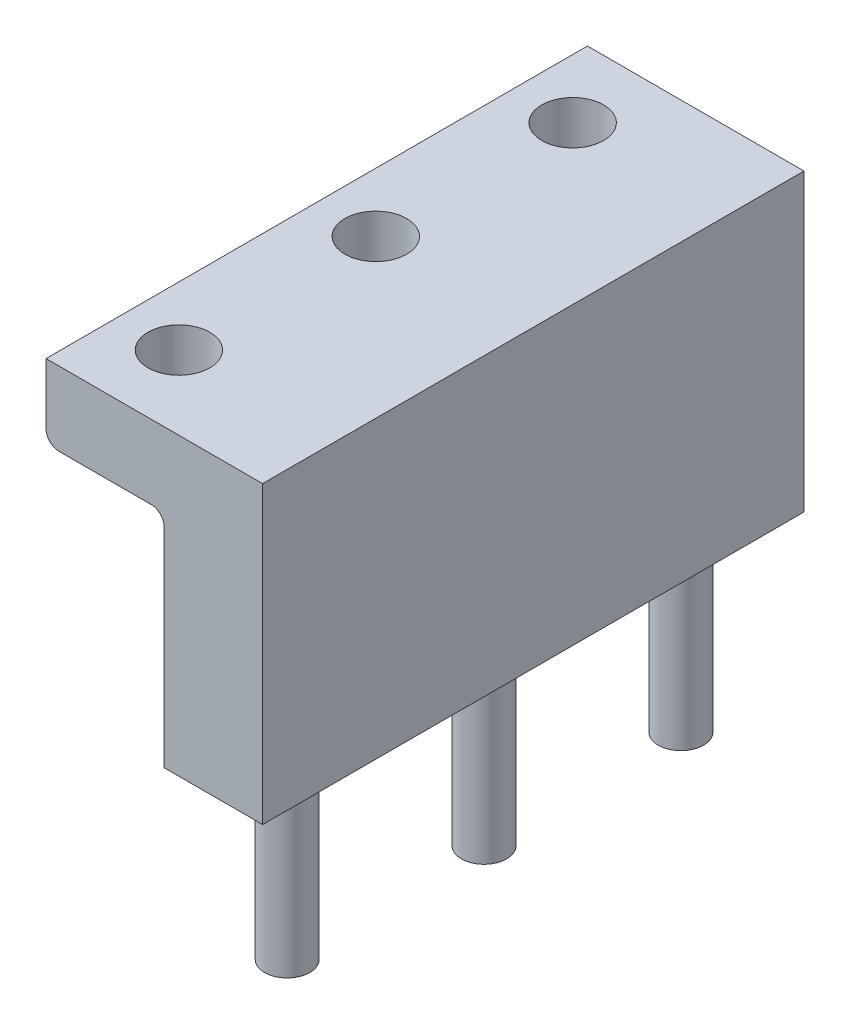
ISO-10303-21;
HEADER;
FILE_DESCRIPTION(('STEP AP214'),'2;1');
FILE_NAME('part.step','',(''),(''),'','','');
FILE_SCHEMA(('AUTOMOTIVE_DESIGN { 1 0 10303 214 1 1 1 1 }'));
ENDSEC;
DATA;
#1=APPLICATION_CONTEXT('core data for automotive mechanical design processes');
#2=APPLICATION_PROTOCOL_DEFINITION('international standard','automotive_design',2000,#1);
#3=PRODUCT_CONTEXT('',#1,'mechanical');
#4=PRODUCT('Part','Part','',(#3));
#5=PRODUCT_RELATED_PRODUCT_CATEGORY('part','',(#4));
#6=PRODUCT_DEFINITION_FORMATION('','',#4);
#7=PRODUCT_DEFINITION_CONTEXT('part definition',#1,'design');
#8=PRODUCT_DEFINITION('design','',#6,#7);
#9=PRODUCT_DEFINITION_SHAPE('','',#8);
#10=(LENGTH_UNIT() NAMED_UNIT(*) SI_UNIT(.MILLI.,.METRE.));
#11=(NAMED_UNIT(*) PLANE_ANGLE_UNIT() SI_UNIT($,.RADIAN.));
#12=(NAMED_UNIT(*) SI_UNIT($,.STERADIAN.) SOLID_ANGLE_UNIT());
#13=UNCERTAINTY_MEASURE_WITH_UNIT(LENGTH_MEASURE(1.E-05),#10,'distance_accuracy_value','');
#14=(GEOMETRIC_REPRESENTATION_CONTEXT(3) GLOBAL_UNCERTAINTY_ASSIGNED_CONTEXT((#13)) GLOBAL_UNIT_ASSIGNED_CONTEXT((#10,
#11,#12)) REPRESENTATION_CONTEXT('',''));
#15=CARTESIAN_POINT('',(0.,0.,0.));
#16=DIRECTION('',(0.,0.,1.));
#17=DIRECTION('',(1.,0.,0.));
#18=AXIS2_PLACEMENT_3D('',#15,#16,#17);
#19=CARTESIAN_POINT('',(374.55475,-81.3562,76.2));
#20=DIRECTION('',(0.,1.,0.));
#21=DIRECTION('',(0.,0.,1.));
#22=AXIS2_PLACEMENT_3D('',#19,#20,#21);
#23=PLANE('',#22);
#24=CARTESIAN_POINT('',(375.285,-81.3562,76.2));
#25=DIRECTION('',(0.,1.,0.));
#26=DIRECTION('',(0.,0.,-1.));
#27=AXIS2_PLACEMENT_3D('',#24,#25,#26);
#28=CIRCLE('',#27,1.4605);
#29=CARTESIAN_POINT('',(375.285,-81.3562,74.7395));
#30=VERTEX_POINT('',#29);
#31=EDGE_CURVE('E11',#30,#30,#28,.T.);
#32=ORIENTED_EDGE('',*,*,#31,.F.);
#33=EDGE_LOOP('',(#32));
#34=FACE_BOUND('',#33,.T.);
#35=ADVANCED_FACE('F17',(#34),#23,.F.);
#36=CARTESIAN_POINT('',(375.285,-75.6031,76.2));
#37=DIRECTION('',(0.,-1.,0.));
#38=DIRECTION('',(0.,0.,-1.));
#39=AXIS2_PLACEMENT_3D('',#36,#37,#38);
#40=CYLINDRICAL_SURFACE('',#39,1.4605);
#41=ORIENTED_EDGE('',*,*,#31,.T.);
#42=EDGE_LOOP('',(#41));
#43=FACE_BOUND('',#42,.T.);
#44=CARTESIAN_POINT('',(375.285,-71.12,76.2));
#45=DIRECTION('',(0.,1.,0.));
#46=DIRECTION('',(0.,0.,-1.));
#47=AXIS2_PLACEMENT_3D('',#44,#45,#46);
#48=CIRCLE('',#47,1.4605);
#49=CARTESIAN_POINT('',(375.285,-71.12,74.7395));
#50=VERTEX_POINT('',#49);
#51=EDGE_CURVE('E164',#50,#50,#48,.T.);
#52=ORIENTED_EDGE('',*,*,#51,.F.);
#53=EDGE_LOOP('',(#52));
#54=FACE_BOUND('',#53,.T.);
#55=ADVANCED_FACE('F175',(#43,#54),#40,.T.);
#56=CARTESIAN_POINT('',(375.285,-69.85,76.2));
#57=DIRECTION('',(0.,1.,0.));
#58=DIRECTION('',(0.,0.,1.));
#59=AXIS2_PLACEMENT_3D('',#56,#57,#58);
#60=CONICAL_SURFACE('',#59,2.7686,0.800175412804941);
#61=ORIENTED_EDGE('',*,*,#51,.T.);
#62=EDGE_LOOP('',(#61));
#63=FACE_BOUND('',#62,.T.);
#64=CARTESIAN_POINT('',(375.285,-69.85,76.2));
#65=DIRECTION('',(0.,1.,0.));
#66=DIRECTION('',(0.,0.,-1.));
#67=AXIS2_PLACEMENT_3D('',#64,#65,#66);
#68=CIRCLE('',#67,2.7686);
#69=CARTESIAN_POINT('',(375.285,-69.85,73.4314));
#70=VERTEX_POINT('',#69);
#71=EDGE_CURVE('E24',#70,#70,#68,.T.);
#72=ORIENTED_EDGE('',*,*,#71,.F.);
#73=EDGE_LOOP('',(#72));
#74=FACE_BOUND('',#73,.T.);
#75=ADVANCED_FACE('F172',(#63,#74),#60,.T.);
#76=CARTESIAN_POINT('',(374.55475,-81.3562,88.9));
#77=DIRECTION('',(0.,1.,0.));
#78=DIRECTION('',(0.,0.,1.));
#79=AXIS2_PLACEMENT_3D('',#76,#77,#78);
#80=PLANE('',#79);
#81=CARTESIAN_POINT('',(375.285,-81.3562,88.9));
#82=DIRECTION('',(0.,1.,0.));
#83=DIRECTION('',(0.,0.,-1.));
#84=AXIS2_PLACEMENT_3D('',#81,#82,#83);
#85=CIRCLE('',#84,1.4605);
#86=CARTESIAN_POINT('',(375.285,-81.3562,87.4395));
#87=VERTEX_POINT('',#86);
#88=EDGE_CURVE('E161',#87,#87,#85,.T.);
#89=ORIENTED_EDGE('',*,*,#88,.F.);
#90=EDGE_LOOP('',(#89));
#91=FACE_BOUND('',#90,.T.);
#92=ADVANCED_FACE('F174',(#91),#80,.F.);
#93=CARTESIAN_POINT('',(375.285,-75.6031,88.9));
#94=DIRECTION('',(0.,-1.,0.));
#95=DIRECTION('',(0.,0.,-1.));
#96=AXIS2_PLACEMENT_3D('',#93,#94,#95);
#97=CYLINDRICAL_SURFACE('',#96,1.4605);
#98=ORIENTED_EDGE('',*,*,#88,.T.);
#99=EDGE_LOOP('',(#98));
#100=FACE_BOUND('',#99,.T.);
#101=CARTESIAN_POINT('',(375.285,-71.12,88.9));
#102=DIRECTION('',(0.,1.,0.));
#103=DIRECTION('',(0.,0.,-1.));
#104=AXIS2_PLACEMENT_3D('',#101,#102,#103);
#105=CIRCLE('',#104,1.4605);
#106=CARTESIAN_POINT('',(375.285,-71.12,87.4395));
#107=VERTEX_POINT('',#106);
#108=EDGE_CURVE('E155',#107,#107,#105,.T.);
#109=ORIENTED_EDGE('',*,*,#108,.F.);
#110=EDGE_LOOP('',(#109));
#111=FACE_BOUND('',#110,.T.);
#112=ADVANCED_FACE('F183',(#100,#111),#97,.T.);
#113=CARTESIAN_POINT('',(375.285,-69.85,88.9));
#114=DIRECTION('',(0.,1.,0.));
#115=DIRECTION('',(0.,0.,1.));
#116=AXIS2_PLACEMENT_3D('',#113,#114,#115);
#117=CONICAL_SURFACE('',#116,2.7686,0.800175412804941);
#118=ORIENTED_EDGE('',*,*,#108,.T.);
#119=EDGE_LOOP('',(#118));
#120=FACE_BOUND('',#119,.T.);
#121=CARTESIAN_POINT('',(375.285,-69.85,88.9));
#122=DIRECTION('',(0.,1.,0.));
#123=DIRECTION('',(0.,0.,-1.));
#124=AXIS2_PLACEMENT_3D('',#121,#122,#123);
#125=CIRCLE('',#124,2.7686);
#126=CARTESIAN_POINT('',(375.285,-69.85,86.1314));
#127=VERTEX_POINT('',#126);
#128=EDGE_CURVE('E158',#127,#127,#125,.T.);
#129=ORIENTED_EDGE('',*,*,#128,.F.);
#130=EDGE_LOOP('',(#129));
#131=FACE_BOUND('',#130,.T.);
#132=ADVANCED_FACE('F216',(#120,#131),#117,.T.);
#133=CARTESIAN_POINT('',(364.49,-53.18125,106.3625));
#134=DIRECTION('',(1.,0.,0.));
#135=DIRECTION('',(0.,0.,1.));
#136=AXIS2_PLACEMENT_3D('',#133,#134,#135);
#137=PLANE('',#136);
#138=DIRECTION('',(0.,1.,0.));
#139=VECTOR('',#138,1.);
#140=CARTESIAN_POINT('',(364.49,-53.18125,106.3625));
#141=LINE('',#140,#139);
#142=CARTESIAN_POINT('',(364.49,-54.7243,106.3625));
#143=VERTEX_POINT('',#142);
#144=CARTESIAN_POINT('',(364.49,-50.8,106.3625));
#145=VERTEX_POINT('',#144);
#146=EDGE_CURVE('E82',#143,#145,#141,.T.);
#147=ORIENTED_EDGE('',*,*,#146,.T.);
#148=DIRECTION('',(0.,0.,-1.));
#149=VECTOR('',#148,1.);
#150=CARTESIAN_POINT('',(364.49,-50.8,106.3625));
#151=LINE('',#150,#149);
#152=CARTESIAN_POINT('',(364.49,-50.8,71.4375));
#153=VERTEX_POINT('',#152);
#154=EDGE_CURVE('E90',#145,#153,#151,.T.);
#155=ORIENTED_EDGE('',*,*,#154,.T.);
#156=DIRECTION('',(0.,1.,0.));
#157=VECTOR('',#156,1.);
#158=CARTESIAN_POINT('',(364.49,-53.18125,71.4375));
#159=LINE('',#158,#157);
#160=CARTESIAN_POINT('',(364.49,-54.7243,71.4375));
#161=VERTEX_POINT('',#160);
#162=EDGE_CURVE('E123',#161,#153,#159,.T.);
#163=ORIENTED_EDGE('',*,*,#162,.F.);
#164=DIRECTION('',(0.,0.,-1.));
#165=VECTOR('',#164,1.);
#166=CARTESIAN_POINT('',(364.49,-54.7243,106.3625));
#167=LINE('',#166,#165);
#168=EDGE_CURVE('E97',#143,#161,#167,.T.);
#169=ORIENTED_EDGE('',*,*,#168,.F.);
#170=EDGE_LOOP('',(#147,#155,#163,#169));
#171=FACE_BOUND('',#170,.T.);
#172=ADVANCED_FACE('F101',(#171),#137,.F.);
#173=CARTESIAN_POINT('',(371.475,-50.8,106.3625));
#174=DIRECTION('',(0.,-1.,0.));
#175=DIRECTION('',(0.,0.,-1.));
#176=AXIS2_PLACEMENT_3D('',#173,#174,#175);
#177=PLANE('',#176);
#178=CARTESIAN_POINT('',(368.3,-50.8,101.6));
#179=DIRECTION('',(0.,1.,0.));
#180=DIRECTION('',(0.,0.,-1.));
#181=AXIS2_PLACEMENT_3D('',#178,#179,#180);
#182=CIRCLE('',#181,1.9939);
#183=CARTESIAN_POINT('',(368.3,-50.8,99.6061));
#184=VERTEX_POINT('',#183);
#185=EDGE_CURVE('E109',#184,#184,#182,.T.);
#186=ORIENTED_EDGE('',*,*,#185,.F.);
#187=EDGE_LOOP('',(#186));
#188=FACE_BOUND('',#187,.T.);
#189=CARTESIAN_POINT('',(368.3,-50.8,88.9));
#190=DIRECTION('',(0.,1.,0.));
#191=DIRECTION('',(0.,0.,-1.));
#192=AXIS2_PLACEMENT_3D('',#189,#190,#191);
#193=CIRCLE('',#192,1.9939);
#194=CARTESIAN_POINT('',(368.3,-50.8,86.9061));
#195=VERTEX_POINT('',#194);
#196=EDGE_CURVE('E371',#195,#195,#193,.T.);
#197=ORIENTED_EDGE('',*,*,#196,.F.);
#198=EDGE_LOOP('',(#197));
#199=FACE_BOUND('',#198,.T.);
#200=CARTESIAN_POINT('',(368.3,-50.8,76.2));
#201=DIRECTION('',(0.,1.,0.));
#202=DIRECTION('',(0.,0.,-1.));
#203=AXIS2_PLACEMENT_3D('',#200,#201,#202);
#204=CIRCLE('',#203,1.9939);
#205=CARTESIAN_POINT('',(368.3,-50.8,74.2061));
#206=VERTEX_POINT('',#205);
#207=EDGE_CURVE('E364',#206,#206,#204,.T.);
#208=ORIENTED_EDGE('',*,*,#207,.F.);
#209=EDGE_LOOP('',(#208));
#210=FACE_BOUND('',#209,.T.);
#211=DIRECTION('',(1.,0.,0.));
#212=VECTOR('',#211,1.);
#213=CARTESIAN_POINT('',(371.475,-50.8,71.4375));
#214=LINE('',#213,#212);
#215=CARTESIAN_POINT('',(378.46,-50.8,71.4375));
#216=VERTEX_POINT('',#215);
#217=EDGE_CURVE('E93',#153,#216,#214,.T.);
#218=ORIENTED_EDGE('',*,*,#217,.F.);
#219=ORIENTED_EDGE('',*,*,#154,.F.);
#220=DIRECTION('',(1.,0.,0.));
#221=VECTOR('',#220,1.);
#222=CARTESIAN_POINT('',(371.475,-50.8,106.3625));
#223=LINE('',#222,#221);
#224=CARTESIAN_POINT('',(378.46,-50.8,106.3625));
#225=VERTEX_POINT('',#224);
#226=EDGE_CURVE('E78',#145,#225,#223,.T.);
#227=ORIENTED_EDGE('',*,*,#226,.T.);
#228=DIRECTION('',(0.,0.,-1.));
#229=VECTOR('',#228,1.);
#230=CARTESIAN_POINT('',(378.46,-50.8,106.3625));
#231=LINE('',#230,#229);
#232=EDGE_CURVE('E98',#225,#216,#231,.T.);
#233=ORIENTED_EDGE('',*,*,#232,.T.);
#234=EDGE_LOOP('',(#218,#219,#227,#233));
#235=FACE_BOUND('',#234,.T.);
#236=ADVANCED_FACE('F91',(#188,#199,#210,#235),#177,.F.);
#237=CARTESIAN_POINT('',(378.46,-60.325,106.3625));
#238=DIRECTION('',(-1.,0.,0.));
#239=DIRECTION('',(0.,1.,0.));
#240=AXIS2_PLACEMENT_3D('',#237,#238,#239);
#241=PLANE('',#240);
#242=DIRECTION('',(0.,-1.,0.));
#243=VECTOR('',#242,1.);
#244=CARTESIAN_POINT('',(378.46,-60.325,71.4375));
#245=LINE('',#244,#243);
#246=CARTESIAN_POINT('',(378.46,-69.85,71.4375));
#247=VERTEX_POINT('',#246);
#248=EDGE_CURVE('E126',#216,#247,#245,.T.);
#249=ORIENTED_EDGE('',*,*,#248,.F.);
#250=ORIENTED_EDGE('',*,*,#232,.F.);
#251=DIRECTION('',(0.,-1.,0.));
#252=VECTOR('',#251,1.);
#253=CARTESIAN_POINT('',(378.46,-60.325,106.3625));
#254=LINE('',#253,#252);
#255=CARTESIAN_POINT('',(378.46,-69.85,106.3625));
#256=VERTEX_POINT('',#255);
#257=EDGE_CURVE('E84',#225,#256,#254,.T.);
#258=ORIENTED_EDGE('',*,*,#257,.T.);
#259=DIRECTION('',(0.,0.,-1.));
#260=VECTOR('',#259,1.);
#261=CARTESIAN_POINT('',(378.46,-69.85,106.3625));
#262=LINE('',#261,#260);
#263=EDGE_CURVE('E136',#256,#247,#262,.T.);
#264=ORIENTED_EDGE('',*,*,#263,.T.);
#265=EDGE_LOOP('',(#249,#250,#258,#264));
#266=FACE_BOUND('',#265,.T.);
#267=ADVANCED_FACE('F237',(#266),#241,.F.);
#268=CARTESIAN_POINT('',(375.285,-69.85,106.3625));
#269=DIRECTION('',(0.,1.,0.));
#270=DIRECTION('',(0.,0.,1.));
#271=AXIS2_PLACEMENT_3D('',#268,#269,#270);
#272=PLANE('',#271);
#273=ORIENTED_EDGE('',*,*,#71,.T.);
#274=EDGE_LOOP('',(#273));
#275=FACE_BOUND('',#274,.T.);
#276=ORIENTED_EDGE('',*,*,#128,.T.);
#277=EDGE_LOOP('',(#276));
#278=FACE_BOUND('',#277,.T.);
#279=CARTESIAN_POINT('',(375.285,-69.85,101.6));
#280=DIRECTION('',(0.,1.,0.));
#281=DIRECTION('',(0.,0.,-1.));
#282=AXIS2_PLACEMENT_3D('',#279,#280,#281);
#283=CIRCLE('',#282,2.7686);
#284=CARTESIAN_POINT('',(375.285,-69.85,98.8314));
#285=VERTEX_POINT('',#284);
#286=EDGE_CURVE('E154',#285,#285,#283,.T.);
#287=ORIENTED_EDGE('',*,*,#286,.T.);
#288=EDGE_LOOP('',(#287));
#289=FACE_BOUND('',#288,.T.);
#290=DIRECTION('',(-1.,0.,0.));
#291=VECTOR('',#290,1.);
#292=CARTESIAN_POINT('',(375.285,-69.85,71.4375));
#293=LINE('',#292,#291);
#294=CARTESIAN_POINT('',(372.11,-69.85,71.4375));
#295=VERTEX_POINT('',#294);
#296=EDGE_CURVE('E129',#247,#295,#293,.T.);
#297=ORIENTED_EDGE('',*,*,#296,.F.);
#298=ORIENTED_EDGE('',*,*,#263,.F.);
#299=DIRECTION('',(-1.,0.,0.));
#300=VECTOR('',#299,1.);
#301=CARTESIAN_POINT('',(375.285,-69.85,106.3625));
#302=LINE('',#301,#300);
#303=CARTESIAN_POINT('',(372.11,-69.85,106.3625));
#304=VERTEX_POINT('',#303);
#305=EDGE_CURVE('E113',#256,#304,#302,.T.);
#306=ORIENTED_EDGE('',*,*,#305,.T.);
#307=DIRECTION('',(0.,0.,-1.));
#308=VECTOR('',#307,1.);
#309=CARTESIAN_POINT('',(372.11,-69.85,106.3625));
#310=LINE('',#309,#308);
#311=EDGE_CURVE('E122',#304,#295,#310,.T.);
#312=ORIENTED_EDGE('',*,*,#311,.T.);
#313=EDGE_LOOP('',(#297,#298,#306,#312));
#314=FACE_BOUND('',#313,.T.);
#315=ADVANCED_FACE('F169',(#275,#278,#289,#314),#272,.F.);
#316=CARTESIAN_POINT('',(372.11,-62.70625,106.3625));
#317=DIRECTION('',(1.,0.,0.));
#318=DIRECTION('',(0.,0.,1.));
#319=AXIS2_PLACEMENT_3D('',#316,#317,#318);
#320=PLANE('',#319);
#321=DIRECTION('',(0.,1.,0.));
#322=VECTOR('',#321,1.);
#323=CARTESIAN_POINT('',(372.11,-62.70625,71.4375));
#324=LINE('',#323,#322);
#325=CARTESIAN_POINT('',(372.11,-56.4007,71.4375));
#326=VERTEX_POINT('',#325);
#327=EDGE_CURVE('E106',#295,#326,#324,.T.);
#328=ORIENTED_EDGE('',*,*,#327,.F.);
#329=ORIENTED_EDGE('',*,*,#311,.F.);
#330=DIRECTION('',(0.,1.,0.));
#331=VECTOR('',#330,1.);
#332=CARTESIAN_POINT('',(372.11,-62.70625,106.3625));
#333=LINE('',#332,#331);
#334=CARTESIAN_POINT('',(372.11,-56.4007,106.3625));
#335=VERTEX_POINT('',#334);
#336=EDGE_CURVE('E116',#304,#335,#333,.T.);
#337=ORIENTED_EDGE('',*,*,#336,.T.);
#338=DIRECTION('',(0.,0.,-1.));
#339=VECTOR('',#338,1.);
#340=CARTESIAN_POINT('',(372.11,-56.4007,106.3625));
#341=LINE('',#340,#339);
#342=EDGE_CURVE('E149',#326,#335,#341,.F.);
#343=ORIENTED_EDGE('',*,*,#342,.F.);
#344=EDGE_LOOP('',(#328,#329,#337,#343));
#345=FACE_BOUND('',#344,.T.);
#346=ADVANCED_FACE('F252',(#345),#320,.F.);
#347=CARTESIAN_POINT('',(368.3,-55.5625,106.3625));
#348=DIRECTION('',(0.,1.,0.));
#349=DIRECTION('',(0.,0.,1.));
#350=AXIS2_PLACEMENT_3D('',#347,#348,#349);
#351=PLANE('',#350);
#352=CARTESIAN_POINT('',(368.3,-55.5625,101.6));
#353=DIRECTION('',(0.,1.,0.));
#354=DIRECTION('',(0.,0.,-1.));
#355=AXIS2_PLACEMENT_3D('',#352,#353,#354);
#356=CIRCLE('',#355,1.9939);
#357=CARTESIAN_POINT('',(368.3,-55.5625,99.6061));
#358=VERTEX_POINT('',#357);
#359=EDGE_CURVE('E361',#358,#358,#356,.T.);
#360=ORIENTED_EDGE('',*,*,#359,.T.);
#361=EDGE_LOOP('',(#360));
#362=FACE_BOUND('',#361,.T.);
#363=CARTESIAN_POINT('',(368.3,-55.5625,88.9));
#364=DIRECTION('',(0.,1.,0.));
#365=DIRECTION('',(0.,0.,-1.));
#366=AXIS2_PLACEMENT_3D('',#363,#364,#365);
#367=CIRCLE('',#366,1.9939);
#368=CARTESIAN_POINT('',(368.3,-55.5625,86.9061));
#369=VERTEX_POINT('',#368);
#370=EDGE_CURVE('E365',#369,#369,#367,.T.);
#371=ORIENTED_EDGE('',*,*,#370,.T.);
#372=EDGE_LOOP('',(#371));
#373=FACE_BOUND('',#372,.T.);
#374=CARTESIAN_POINT('',(368.3,-55.5625,76.2));
#375=DIRECTION('',(0.,1.,0.));
#376=DIRECTION('',(0.,0.,-1.));
#377=AXIS2_PLACEMENT_3D('',#374,#375,#376);
#378=CIRCLE('',#377,1.9939);
#379=CARTESIAN_POINT('',(368.3,-55.5625,74.2061));
#380=VERTEX_POINT('',#379);
#381=EDGE_CURVE('E360',#380,#380,#378,.T.);
#382=ORIENTED_EDGE('',*,*,#381,.T.);
#383=EDGE_LOOP('',(#382));
#384=FACE_BOUND('',#383,.T.);
#385=DIRECTION('',(-1.,0.,0.));
#386=VECTOR('',#385,1.);
#387=CARTESIAN_POINT('',(368.3,-55.5625,71.4375));
#388=LINE('',#387,#386);
#389=CARTESIAN_POINT('',(371.2718,-55.5625,71.4375));
#390=VERTEX_POINT('',#389);
#391=CARTESIAN_POINT('',(365.3282,-55.5625,71.4375));
#392=VERTEX_POINT('',#391);
#393=EDGE_CURVE('E103',#390,#392,#388,.T.);
#394=ORIENTED_EDGE('',*,*,#393,.F.);
#395=DIRECTION('',(0.,0.,-1.));
#396=VECTOR('',#395,1.);
#397=CARTESIAN_POINT('',(371.2718,-55.5625,71.4375));
#398=LINE('',#397,#396);
#399=CARTESIAN_POINT('',(371.2718,-55.5625,106.3625));
#400=VERTEX_POINT('',#399);
#401=EDGE_CURVE('E143',#400,#390,#398,.T.);
#402=ORIENTED_EDGE('',*,*,#401,.F.);
#403=DIRECTION('',(-1.,0.,0.));
#404=VECTOR('',#403,1.);
#405=CARTESIAN_POINT('',(368.3,-55.5625,106.3625));
#406=LINE('',#405,#404);
#407=CARTESIAN_POINT('',(365.3282,-55.5625,106.3625));
#408=VERTEX_POINT('',#407);
#409=EDGE_CURVE('E119',#400,#408,#406,.T.);
#410=ORIENTED_EDGE('',*,*,#409,.T.);
#411=DIRECTION('',(0.,0.,-1.));
#412=VECTOR('',#411,1.);
#413=CARTESIAN_POINT('',(365.3282,-55.5625,106.3625));
#414=LINE('',#413,#412);
#415=EDGE_CURVE('E146',#392,#408,#414,.F.);
#416=ORIENTED_EDGE('',*,*,#415,.F.);
#417=EDGE_LOOP('',(#394,#402,#410,#416));
#418=FACE_BOUND('',#417,.T.);
#419=ADVANCED_FACE('F259',(#362,#373,#384,#418),#351,.F.);
#420=CARTESIAN_POINT('',(371.475,-60.325,106.3625));
#421=DIRECTION('',(0.,0.,1.));
#422=DIRECTION('',(-1.,0.,0.));
#423=AXIS2_PLACEMENT_3D('',#420,#421,#422);
#424=PLANE('',#423);
#425=ORIENTED_EDGE('',*,*,#409,.F.);
#426=CARTESIAN_POINT('',(371.2718,-56.4007,106.3625));
#427=DIRECTION('',(0.,0.,-1.));
#428=DIRECTION('',(-1.,0.,0.));
#429=AXIS2_PLACEMENT_3D('',#426,#427,#428);
#430=CIRCLE('',#429,0.8382);
#431=EDGE_CURVE('E31',#335,#400,#430,.F.);
#432=ORIENTED_EDGE('',*,*,#431,.F.);
#433=ORIENTED_EDGE('',*,*,#336,.F.);
#434=ORIENTED_EDGE('',*,*,#305,.F.);
#435=ORIENTED_EDGE('',*,*,#257,.F.);
#436=ORIENTED_EDGE('',*,*,#226,.F.);
#437=ORIENTED_EDGE('',*,*,#146,.F.);
#438=CARTESIAN_POINT('',(365.3282,-54.7243,106.3625));
#439=DIRECTION('',(0.,0.,-1.));
#440=DIRECTION('',(-1.,0.,0.));
#441=AXIS2_PLACEMENT_3D('',#438,#439,#440);
#442=CIRCLE('',#441,0.8382);
#443=EDGE_CURVE('E37',#408,#143,#442,.T.);
#444=ORIENTED_EDGE('',*,*,#443,.F.);
#445=EDGE_LOOP('',(#425,#432,#433,#434,#435,#436,#437,#444));
#446=FACE_BOUND('',#445,.T.);
#447=ADVANCED_FACE('F80',(#446),#424,.T.);
#448=CARTESIAN_POINT('',(371.475,-60.325,71.4375));
#449=DIRECTION('',(0.,0.,1.));
#450=DIRECTION('',(-1.,0.,0.));
#451=AXIS2_PLACEMENT_3D('',#448,#449,#450);
#452=PLANE('',#451);
#453=ORIENTED_EDGE('',*,*,#162,.T.);
#454=ORIENTED_EDGE('',*,*,#217,.T.);
#455=ORIENTED_EDGE('',*,*,#248,.T.);
#456=ORIENTED_EDGE('',*,*,#296,.T.);
#457=ORIENTED_EDGE('',*,*,#327,.T.);
#458=CARTESIAN_POINT('',(371.2718,-56.4007,71.4375));
#459=DIRECTION('',(0.,0.,-1.));
#460=DIRECTION('',(-1.,0.,0.));
#461=AXIS2_PLACEMENT_3D('',#458,#459,#460);
#462=CIRCLE('',#461,0.8382);
#463=EDGE_CURVE('E151',#390,#326,#462,.T.);
#464=ORIENTED_EDGE('',*,*,#463,.F.);
#465=ORIENTED_EDGE('',*,*,#393,.T.);
#466=CARTESIAN_POINT('',(365.3282,-54.7243,71.4375));
#467=DIRECTION('',(0.,0.,-1.));
#468=DIRECTION('',(-1.,0.,0.));
#469=AXIS2_PLACEMENT_3D('',#466,#467,#468);
#470=CIRCLE('',#469,0.8382);
#471=EDGE_CURVE('E141',#161,#392,#470,.F.);
#472=ORIENTED_EDGE('',*,*,#471,.F.);
#473=EDGE_LOOP('',(#453,#454,#455,#456,#457,#464,#465,#472));
#474=FACE_BOUND('',#473,.T.);
#475=ADVANCED_FACE('F274',(#474),#452,.F.);
#476=CARTESIAN_POINT('',(368.3,-30.1625,76.2));
#477=DIRECTION('',(0.,-1.,0.));
#478=DIRECTION('',(0.,0.,-1.));
#479=AXIS2_PLACEMENT_3D('',#476,#477,#478);
#480=CYLINDRICAL_SURFACE('',#479,1.9939);
#481=ORIENTED_EDGE('',*,*,#381,.F.);
#482=EDGE_LOOP('',(#481));
#483=FACE_BOUND('',#482,.T.);
#484=ORIENTED_EDGE('',*,*,#207,.T.);
#485=EDGE_LOOP('',(#484));
#486=FACE_BOUND('',#485,.T.);
#487=ADVANCED_FACE('F281',(#483,#486),#480,.F.);
#488=CARTESIAN_POINT('',(368.3,-30.1625,88.9));
#489=DIRECTION('',(0.,-1.,0.));
#490=DIRECTION('',(0.,0.,-1.));
#491=AXIS2_PLACEMENT_3D('',#488,#489,#490);
#492=CYLINDRICAL_SURFACE('',#491,1.9939);
#493=ORIENTED_EDGE('',*,*,#370,.F.);
#494=EDGE_LOOP('',(#493));
#495=FACE_BOUND('',#494,.T.);
#496=ORIENTED_EDGE('',*,*,#196,.T.);
#497=EDGE_LOOP('',(#496));
#498=FACE_BOUND('',#497,.T.);
#499=ADVANCED_FACE('F289',(#495,#498),#492,.F.);
#500=CARTESIAN_POINT('',(368.3,-30.1625,101.6));
#501=DIRECTION('',(0.,-1.,0.));
#502=DIRECTION('',(0.,0.,-1.));
#503=AXIS2_PLACEMENT_3D('',#500,#501,#502);
#504=CYLINDRICAL_SURFACE('',#503,1.9939);
#505=ORIENTED_EDGE('',*,*,#359,.F.);
#506=EDGE_LOOP('',(#505));
#507=FACE_BOUND('',#506,.T.);
#508=ORIENTED_EDGE('',*,*,#185,.T.);
#509=EDGE_LOOP('',(#508));
#510=FACE_BOUND('',#509,.T.);
#511=ADVANCED_FACE('F297',(#507,#510),#504,.F.);
#512=CARTESIAN_POINT('',(365.3282,-54.7243,106.3625));
#513=DIRECTION('',(0.,0.,-1.));
#514=DIRECTION('',(1.,0.,0.));
#515=AXIS2_PLACEMENT_3D('',#512,#513,#514);
#516=CYLINDRICAL_SURFACE('',#515,0.8382);
#517=ORIENTED_EDGE('',*,*,#443,.T.);
#518=ORIENTED_EDGE('',*,*,#168,.T.);
#519=ORIENTED_EDGE('',*,*,#471,.T.);
#520=ORIENTED_EDGE('',*,*,#415,.T.);
#521=EDGE_LOOP('',(#517,#518,#519,#520));
#522=FACE_BOUND('',#521,.T.);
#523=ADVANCED_FACE('F305',(#522),#516,.T.);
#524=CARTESIAN_POINT('',(371.2718,-56.4007,106.3625));
#525=DIRECTION('',(0.,0.,1.));
#526=DIRECTION('',(-1.,0.,0.));
#527=AXIS2_PLACEMENT_3D('',#524,#525,#526);
#528=CYLINDRICAL_SURFACE('',#527,0.8382);
#529=ORIENTED_EDGE('',*,*,#431,.T.);
#530=ORIENTED_EDGE('',*,*,#401,.T.);
#531=ORIENTED_EDGE('',*,*,#463,.T.);
#532=ORIENTED_EDGE('',*,*,#342,.T.);
#533=EDGE_LOOP('',(#529,#530,#531,#532));
#534=FACE_BOUND('',#533,.T.);
#535=ADVANCED_FACE('F313',(#534),#528,.F.);
#536=CARTESIAN_POINT('',(374.55475,-81.3562,101.6));
#537=DIRECTION('',(0.,1.,0.));
#538=DIRECTION('',(0.,0.,1.));
#539=AXIS2_PLACEMENT_3D('',#536,#537,#538);
#540=PLANE('',#539);
#541=CARTESIAN_POINT('',(375.285,-81.3562,101.6));
#542=DIRECTION('',(0.,1.,0.));
#543=DIRECTION('',(0.,0.,-1.));
#544=AXIS2_PLACEMENT_3D('',#541,#542,#543);
#545=CIRCLE('',#544,1.4605);
#546=CARTESIAN_POINT('',(375.285,-81.3562,100.1395));
#547=VERTEX_POINT('',#546);
#548=EDGE_CURVE('E357',#547,#547,#545,.T.);
#549=ORIENTED_EDGE('',*,*,#548,.F.);
#550=EDGE_LOOP('',(#549));
#551=FACE_BOUND('',#550,.T.);
#552=ADVANCED_FACE('F321',(#551),#540,.F.);
#553=CARTESIAN_POINT('',(375.285,-75.6031,101.6));
#554=DIRECTION('',(0.,-1.,0.));
#555=DIRECTION('',(0.,0.,-1.));
#556=AXIS2_PLACEMENT_3D('',#553,#554,#555);
#557=CYLINDRICAL_SURFACE('',#556,1.4605);
#558=ORIENTED_EDGE('',*,*,#548,.T.);
#559=EDGE_LOOP('',(#558));
#560=FACE_BOUND('',#559,.T.);
#561=CARTESIAN_POINT('',(375.285,-71.12,101.6));
#562=DIRECTION('',(0.,1.,0.));
#563=DIRECTION('',(0.,0.,-1.));
#564=AXIS2_PLACEMENT_3D('',#561,#562,#563);
#565=CIRCLE('',#564,1.4605);
#566=CARTESIAN_POINT('',(375.285,-71.12,100.1395));
#567=VERTEX_POINT('',#566);
#568=EDGE_CURVE('E350',#567,#567,#565,.T.);
#569=ORIENTED_EDGE('',*,*,#568,.F.);
#570=EDGE_LOOP('',(#569));
#571=FACE_BOUND('',#570,.T.);
#572=ADVANCED_FACE('F329',(#560,#571),#557,.T.);
#573=CARTESIAN_POINT('',(375.285,-69.85,101.6));
#574=DIRECTION('',(0.,1.,0.));
#575=DIRECTION('',(0.,0.,1.));
#576=AXIS2_PLACEMENT_3D('',#573,#574,#575);
#577=CONICAL_SURFACE('',#576,2.7686,0.800175412804941);
#578=ORIENTED_EDGE('',*,*,#568,.T.);
#579=EDGE_LOOP('',(#578));
#580=FACE_BOUND('',#579,.T.);
#581=ORIENTED_EDGE('',*,*,#286,.F.);
#582=EDGE_LOOP('',(#581));
#583=FACE_BOUND('',#582,.T.);
#584=ADVANCED_FACE('F337',(#580,#583),#577,.T.);
#585=CLOSED_SHELL('',(#35,#55,#75,#92,#112,#132,#172,#236,#267,#315,#346,#419,#447,#475,#487,
#499,#511,#523,#535,#552,#572,#584));
#586=MANIFOLD_SOLID_BREP('B1',#585);
#587=ADVANCED_BREP_SHAPE_REPRESENTATION('',(#18,#586),#14);
#588=SHAPE_DEFINITION_REPRESENTATION(#9,#587);
ENDSEC;
END-ISO-10303-21;
